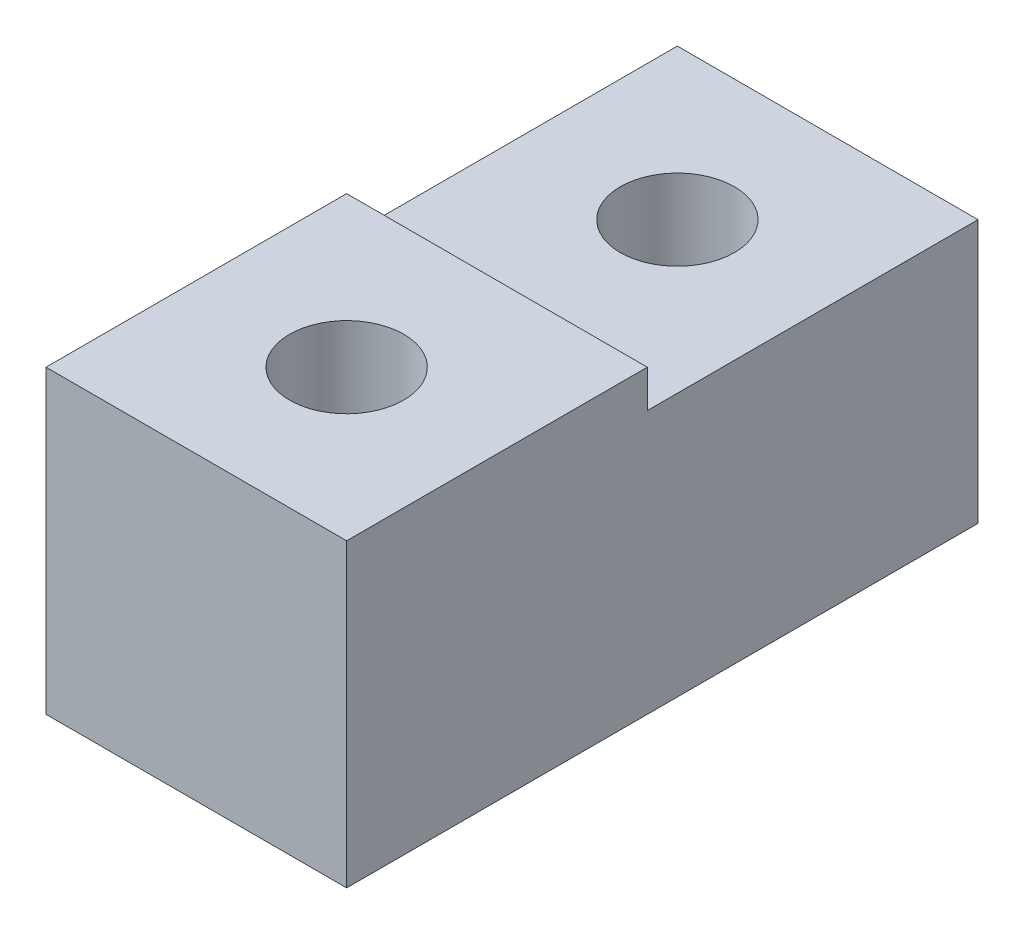
ISO-10303-21;
HEADER;
FILE_DESCRIPTION(('STEP AP214'),'2;1');
FILE_NAME('part.step','',(''),(''),'','','');
FILE_SCHEMA(('AUTOMOTIVE_DESIGN { 1 0 10303 214 1 1 1 1 }'));
ENDSEC;
DATA;
#1=APPLICATION_CONTEXT('core data for automotive mechanical design processes');
#2=APPLICATION_PROTOCOL_DEFINITION('international standard','automotive_design',2000,#1);
#3=PRODUCT_CONTEXT('',#1,'mechanical');
#4=PRODUCT('Part','Part','',(#3));
#5=PRODUCT_RELATED_PRODUCT_CATEGORY('part','',(#4));
#6=PRODUCT_DEFINITION_FORMATION('','',#4);
#7=PRODUCT_DEFINITION_CONTEXT('part definition',#1,'design');
#8=PRODUCT_DEFINITION('design','',#6,#7);
#9=PRODUCT_DEFINITION_SHAPE('','',#8);
#10=(LENGTH_UNIT() NAMED_UNIT(*) SI_UNIT(.MILLI.,.METRE.));
#11=(NAMED_UNIT(*) PLANE_ANGLE_UNIT() SI_UNIT($,.RADIAN.));
#12=(NAMED_UNIT(*) SI_UNIT($,.STERADIAN.) SOLID_ANGLE_UNIT());
#13=UNCERTAINTY_MEASURE_WITH_UNIT(LENGTH_MEASURE(1.E-05),#10,'distance_accuracy_value','');
#14=(GEOMETRIC_REPRESENTATION_CONTEXT(3) GLOBAL_UNCERTAINTY_ASSIGNED_CONTEXT((#13)) GLOBAL_UNIT_ASSIGNED_CONTEXT((#10,
#11,#12)) REPRESENTATION_CONTEXT('',''));
#15=CARTESIAN_POINT('',(0.,0.,0.));
#16=DIRECTION('',(0.,0.,1.));
#17=DIRECTION('',(1.,0.,0.));
#18=AXIS2_PLACEMENT_3D('',#15,#16,#17);
#19=CARTESIAN_POINT('',(-5.,10.,-10.5));
#20=DIRECTION('',(0.,0.,1.));
#21=DIRECTION('',(1.,0.,0.));
#22=AXIS2_PLACEMENT_3D('',#19,#20,#21);
#23=PLANE('',#22);
#24=DIRECTION('',(-1.,0.,0.));
#25=VECTOR('',#24,1.);
#26=CARTESIAN_POINT('',(-5.,8.75,-10.5));
#27=LINE('',#26,#25);
#28=CARTESIAN_POINT('',(5.,8.75,-10.5));
#29=VERTEX_POINT('',#28);
#30=CARTESIAN_POINT('',(-5.,8.75,-10.5));
#31=VERTEX_POINT('',#30);
#32=EDGE_CURVE('E120',#29,#31,#27,.T.);
#33=ORIENTED_EDGE('',*,*,#32,.F.);
#34=DIRECTION('',(0.,-1.,0.));
#35=VECTOR('',#34,1.);
#36=CARTESIAN_POINT('',(5.,10.,-10.5));
#37=LINE('',#36,#35);
#38=CARTESIAN_POINT('',(5.,0.,-10.5));
#39=VERTEX_POINT('',#38);
#40=EDGE_CURVE('E11',#29,#39,#37,.T.);
#41=ORIENTED_EDGE('',*,*,#40,.T.);
#42=DIRECTION('',(-1.,0.,0.));
#43=VECTOR('',#42,1.);
#44=CARTESIAN_POINT('',(-5.,0.,-10.5));
#45=LINE('',#44,#43);
#46=CARTESIAN_POINT('',(-5.,0.,-10.5));
#47=VERTEX_POINT('',#46);
#48=EDGE_CURVE('E99',#39,#47,#45,.T.);
#49=ORIENTED_EDGE('',*,*,#48,.T.);
#50=DIRECTION('',(0.,-1.,0.));
#51=VECTOR('',#50,1.);
#52=CARTESIAN_POINT('',(-5.,10.,-10.5));
#53=LINE('',#52,#51);
#54=EDGE_CURVE('E42',#31,#47,#53,.T.);
#55=ORIENTED_EDGE('',*,*,#54,.F.);
#56=EDGE_LOOP('',(#33,#41,#49,#55));
#57=FACE_BOUND('',#56,.T.);
#58=ADVANCED_FACE('F33',(#57),#23,.F.);
#59=CARTESIAN_POINT('',(5.,10.,10.5));
#60=DIRECTION('',(-1.,0.,0.));
#61=DIRECTION('',(0.,0.,1.));
#62=AXIS2_PLACEMENT_3D('',#59,#60,#61);
#63=PLANE('',#62);
#64=DIRECTION('',(0.,0.,-1.));
#65=VECTOR('',#64,1.);
#66=CARTESIAN_POINT('',(5.,8.75,-10.5));
#67=LINE('',#66,#65);
#68=CARTESIAN_POINT('',(5.,8.75,0.5));
#69=VERTEX_POINT('',#68);
#70=EDGE_CURVE('E123',#69,#29,#67,.T.);
#71=ORIENTED_EDGE('',*,*,#70,.F.);
#72=DIRECTION('',(0.,1.,0.));
#73=VECTOR('',#72,1.);
#74=CARTESIAN_POINT('',(5.,8.75,0.5));
#75=LINE('',#74,#73);
#76=CARTESIAN_POINT('',(5.,10.,0.5));
#77=VERTEX_POINT('',#76);
#78=EDGE_CURVE('E100',#69,#77,#75,.T.);
#79=ORIENTED_EDGE('',*,*,#78,.T.);
#80=DIRECTION('',(0.,0.,-1.));
#81=VECTOR('',#80,1.);
#82=CARTESIAN_POINT('',(5.,10.,10.5));
#83=LINE('',#82,#81);
#84=CARTESIAN_POINT('',(5.,10.,10.5));
#85=VERTEX_POINT('',#84);
#86=EDGE_CURVE('E86',#85,#77,#83,.T.);
#87=ORIENTED_EDGE('',*,*,#86,.F.);
#88=DIRECTION('',(0.,-1.,0.));
#89=VECTOR('',#88,1.);
#90=CARTESIAN_POINT('',(5.,10.,10.5));
#91=LINE('',#90,#89);
#92=CARTESIAN_POINT('',(5.,0.,10.5));
#93=VERTEX_POINT('',#92);
#94=EDGE_CURVE('E79',#85,#93,#91,.T.);
#95=ORIENTED_EDGE('',*,*,#94,.T.);
#96=DIRECTION('',(0.,0.,-1.));
#97=VECTOR('',#96,1.);
#98=CARTESIAN_POINT('',(5.,0.,10.5));
#99=LINE('',#98,#97);
#100=EDGE_CURVE('E93',#93,#39,#99,.T.);
#101=ORIENTED_EDGE('',*,*,#100,.T.);
#102=ORIENTED_EDGE('',*,*,#40,.F.);
#103=EDGE_LOOP('',(#71,#79,#87,#95,#101,#102));
#104=FACE_BOUND('',#103,.T.);
#105=ADVANCED_FACE('F35',(#104),#63,.F.);
#106=CARTESIAN_POINT('',(-5.,10.,10.5));
#107=DIRECTION('',(1.,0.,0.));
#108=DIRECTION('',(0.,0.,-1.));
#109=AXIS2_PLACEMENT_3D('',#106,#107,#108);
#110=PLANE('',#109);
#111=DIRECTION('',(0.,0.,1.));
#112=VECTOR('',#111,1.);
#113=CARTESIAN_POINT('',(-5.,10.,10.5));
#114=LINE('',#113,#112);
#115=CARTESIAN_POINT('',(-5.,10.,0.500000000000004));
#116=VERTEX_POINT('',#115);
#117=CARTESIAN_POINT('',(-5.,10.,10.5));
#118=VERTEX_POINT('',#117);
#119=EDGE_CURVE('E139',#116,#118,#114,.T.);
#120=ORIENTED_EDGE('',*,*,#119,.F.);
#121=DIRECTION('',(0.,1.,0.));
#122=VECTOR('',#121,1.);
#123=CARTESIAN_POINT('',(-5.,8.75,0.5));
#124=LINE('',#123,#122);
#125=CARTESIAN_POINT('',(-5.,8.75,0.5));
#126=VERTEX_POINT('',#125);
#127=EDGE_CURVE('E49',#126,#116,#124,.T.);
#128=ORIENTED_EDGE('',*,*,#127,.F.);
#129=DIRECTION('',(0.,0.,1.));
#130=VECTOR('',#129,1.);
#131=CARTESIAN_POINT('',(-5.,8.75,-10.5));
#132=LINE('',#131,#130);
#133=EDGE_CURVE('E115',#31,#126,#132,.T.);
#134=ORIENTED_EDGE('',*,*,#133,.F.);
#135=ORIENTED_EDGE('',*,*,#54,.T.);
#136=DIRECTION('',(0.,0.,1.));
#137=VECTOR('',#136,1.);
#138=CARTESIAN_POINT('',(-5.,0.,10.5));
#139=LINE('',#138,#137);
#140=CARTESIAN_POINT('',(-5.,0.,10.5));
#141=VERTEX_POINT('',#140);
#142=EDGE_CURVE('E87',#47,#141,#139,.T.);
#143=ORIENTED_EDGE('',*,*,#142,.T.);
#144=DIRECTION('',(0.,-1.,0.));
#145=VECTOR('',#144,1.);
#146=CARTESIAN_POINT('',(-5.,10.,10.5));
#147=LINE('',#146,#145);
#148=EDGE_CURVE('E82',#118,#141,#147,.T.);
#149=ORIENTED_EDGE('',*,*,#148,.F.);
#150=EDGE_LOOP('',(#120,#128,#134,#135,#143,#149));
#151=FACE_BOUND('',#150,.T.);
#152=ADVANCED_FACE('F113',(#151),#110,.F.);
#153=CARTESIAN_POINT('',(-5.,10.,10.5));
#154=DIRECTION('',(0.,0.,-1.));
#155=DIRECTION('',(-1.,0.,0.));
#156=AXIS2_PLACEMENT_3D('',#153,#154,#155);
#157=PLANE('',#156);
#158=DIRECTION('',(1.,0.,0.));
#159=VECTOR('',#158,1.);
#160=CARTESIAN_POINT('',(-5.,0.,10.5));
#161=LINE('',#160,#159);
#162=EDGE_CURVE('E76',#141,#93,#161,.T.);
#163=ORIENTED_EDGE('',*,*,#162,.T.);
#164=ORIENTED_EDGE('',*,*,#94,.F.);
#165=DIRECTION('',(1.,0.,0.));
#166=VECTOR('',#165,1.);
#167=CARTESIAN_POINT('',(-5.,10.,10.5));
#168=LINE('',#167,#166);
#169=EDGE_CURVE('E58',#118,#85,#168,.T.);
#170=ORIENTED_EDGE('',*,*,#169,.F.);
#171=ORIENTED_EDGE('',*,*,#148,.T.);
#172=EDGE_LOOP('',(#163,#164,#170,#171));
#173=FACE_BOUND('',#172,.T.);
#174=ADVANCED_FACE('F78',(#173),#157,.F.);
#175=CARTESIAN_POINT('',(0.,10.,0.));
#176=DIRECTION('',(0.,-1.,0.));
#177=DIRECTION('',(0.,0.,-1.));
#178=AXIS2_PLACEMENT_3D('',#175,#176,#177);
#179=PLANE('',#178);
#180=CARTESIAN_POINT('',(0.,10.,5.5));
#181=DIRECTION('',(0.,-1.,0.));
#182=DIRECTION('',(0.,0.,-1.));
#183=AXIS2_PLACEMENT_3D('',#180,#181,#182);
#184=CIRCLE('',#183,1.89865);
#185=CARTESIAN_POINT('',(0.,10.,3.60135));
#186=VERTEX_POINT('',#185);
#187=EDGE_CURVE('E145',#186,#186,#184,.T.);
#188=ORIENTED_EDGE('',*,*,#187,.T.);
#189=EDGE_LOOP('',(#188));
#190=FACE_BOUND('',#189,.T.);
#191=ORIENTED_EDGE('',*,*,#86,.T.);
#192=DIRECTION('',(1.,0.,0.));
#193=VECTOR('',#192,1.);
#194=CARTESIAN_POINT('',(-5.,10.,0.5));
#195=LINE('',#194,#193);
#196=EDGE_CURVE('E133',#116,#77,#195,.T.);
#197=ORIENTED_EDGE('',*,*,#196,.F.);
#198=ORIENTED_EDGE('',*,*,#119,.T.);
#199=ORIENTED_EDGE('',*,*,#169,.T.);
#200=EDGE_LOOP('',(#191,#197,#198,#199));
#201=FACE_BOUND('',#200,.T.);
#202=ADVANCED_FACE('F144',(#190,#201),#179,.F.);
#203=CARTESIAN_POINT('',(0.,0.,0.));
#204=DIRECTION('',(0.,-1.,0.));
#205=DIRECTION('',(0.,0.,-1.));
#206=AXIS2_PLACEMENT_3D('',#203,#204,#205);
#207=PLANE('',#206);
#208=CARTESIAN_POINT('',(0.,0.,-5.5));
#209=DIRECTION('',(0.,-1.,0.));
#210=DIRECTION('',(0.,0.,-1.));
#211=AXIS2_PLACEMENT_3D('',#208,#209,#210);
#212=CIRCLE('',#211,3.5433);
#213=CARTESIAN_POINT('',(0.,0.,-9.0433));
#214=VERTEX_POINT('',#213);
#215=EDGE_CURVE('E162',#214,#214,#212,.T.);
#216=ORIENTED_EDGE('',*,*,#215,.F.);
#217=EDGE_LOOP('',(#216));
#218=FACE_BOUND('',#217,.T.);
#219=CARTESIAN_POINT('',(0.,0.,5.5));
#220=DIRECTION('',(0.,-1.,0.));
#221=DIRECTION('',(0.,0.,-1.));
#222=AXIS2_PLACEMENT_3D('',#219,#220,#221);
#223=CIRCLE('',#222,3.96875);
#224=CARTESIAN_POINT('',(0.,0.,1.53125000000001));
#225=VERTEX_POINT('',#224);
#226=EDGE_CURVE('E156',#225,#225,#223,.T.);
#227=ORIENTED_EDGE('',*,*,#226,.F.);
#228=EDGE_LOOP('',(#227));
#229=FACE_BOUND('',#228,.T.);
#230=ORIENTED_EDGE('',*,*,#100,.F.);
#231=ORIENTED_EDGE('',*,*,#162,.F.);
#232=ORIENTED_EDGE('',*,*,#142,.F.);
#233=ORIENTED_EDGE('',*,*,#48,.F.);
#234=EDGE_LOOP('',(#230,#231,#232,#233));
#235=FACE_BOUND('',#234,.T.);
#236=ADVANCED_FACE('F97',(#218,#229,#235),#207,.T.);
#237=CARTESIAN_POINT('',(-5.,8.75,0.5));
#238=DIRECTION('',(0.,0.,1.));
#239=DIRECTION('',(1.,0.,0.));
#240=AXIS2_PLACEMENT_3D('',#237,#238,#239);
#241=PLANE('',#240);
#242=ORIENTED_EDGE('',*,*,#196,.T.);
#243=ORIENTED_EDGE('',*,*,#78,.F.);
#244=DIRECTION('',(1.,0.,0.));
#245=VECTOR('',#244,1.);
#246=CARTESIAN_POINT('',(-5.,8.75,0.5));
#247=LINE('',#246,#245);
#248=EDGE_CURVE('E134',#126,#69,#247,.T.);
#249=ORIENTED_EDGE('',*,*,#248,.F.);
#250=ORIENTED_EDGE('',*,*,#127,.T.);
#251=EDGE_LOOP('',(#242,#243,#249,#250));
#252=FACE_BOUND('',#251,.T.);
#253=ADVANCED_FACE('F135',(#252),#241,.F.);
#254=CARTESIAN_POINT('',(0.,8.75,0.));
#255=DIRECTION('',(0.,1.,0.));
#256=DIRECTION('',(0.,0.,1.));
#257=AXIS2_PLACEMENT_3D('',#254,#255,#256);
#258=PLANE('',#257);
#259=CARTESIAN_POINT('',(0.,8.75,-5.5));
#260=DIRECTION('',(0.,1.,0.));
#261=DIRECTION('',(0.,0.,1.));
#262=AXIS2_PLACEMENT_3D('',#259,#260,#261);
#263=CIRCLE('',#262,1.89865);
#264=CARTESIAN_POINT('',(0.,8.75,-3.60135));
#265=VERTEX_POINT('',#264);
#266=EDGE_CURVE('E37',#265,#265,#263,.T.);
#267=ORIENTED_EDGE('',*,*,#266,.F.);
#268=EDGE_LOOP('',(#267));
#269=FACE_BOUND('',#268,.T.);
#270=ORIENTED_EDGE('',*,*,#133,.T.);
#271=ORIENTED_EDGE('',*,*,#248,.T.);
#272=ORIENTED_EDGE('',*,*,#70,.T.);
#273=ORIENTED_EDGE('',*,*,#32,.T.);
#274=EDGE_LOOP('',(#270,#271,#272,#273));
#275=FACE_BOUND('',#274,.T.);
#276=ADVANCED_FACE('F137',(#269,#275),#258,.T.);
#277=CARTESIAN_POINT('',(0.,0.,5.5));
#278=DIRECTION('',(0.,-1.,0.));
#279=DIRECTION('',(0.,0.,-1.));
#280=AXIS2_PLACEMENT_3D('',#277,#278,#279);
#281=CYLINDRICAL_SURFACE('',#280,1.89865);
#282=ORIENTED_EDGE('',*,*,#187,.F.);
#283=EDGE_LOOP('',(#282));
#284=FACE_BOUND('',#283,.T.);
#285=CARTESIAN_POINT('',(0.,2.2098,5.5));
#286=DIRECTION('',(0.,-1.,0.));
#287=DIRECTION('',(0.,0.,-1.));
#288=AXIS2_PLACEMENT_3D('',#285,#286,#287);
#289=CIRCLE('',#288,1.89865000000001);
#290=CARTESIAN_POINT('',(0.,2.2098,3.60134999999999));
#291=VERTEX_POINT('',#290);
#292=EDGE_CURVE('E147',#291,#291,#289,.T.);
#293=ORIENTED_EDGE('',*,*,#292,.T.);
#294=EDGE_LOOP('',(#293));
#295=FACE_BOUND('',#294,.T.);
#296=ADVANCED_FACE('F185',(#284,#295),#281,.F.);
#297=CARTESIAN_POINT('',(1.89865000000001,2.2098,5.5));
#298=DIRECTION('',(0.,1.,0.));
#299=DIRECTION('',(0.,0.,1.));
#300=AXIS2_PLACEMENT_3D('',#297,#298,#299);
#301=PLANE('',#300);
#302=ORIENTED_EDGE('',*,*,#292,.F.);
#303=EDGE_LOOP('',(#302));
#304=FACE_BOUND('',#303,.T.);
#305=CARTESIAN_POINT('',(0.,2.2098,5.5));
#306=DIRECTION('',(0.,-1.,0.));
#307=DIRECTION('',(0.,0.,-1.));
#308=AXIS2_PLACEMENT_3D('',#305,#306,#307);
#309=CIRCLE('',#308,3.96875);
#310=CARTESIAN_POINT('',(0.,2.2098,1.53125000000001));
#311=VERTEX_POINT('',#310);
#312=EDGE_CURVE('E153',#311,#311,#309,.T.);
#313=ORIENTED_EDGE('',*,*,#312,.T.);
#314=EDGE_LOOP('',(#313));
#315=FACE_BOUND('',#314,.T.);
#316=ADVANCED_FACE('F176',(#304,#315),#301,.F.);
#317=CARTESIAN_POINT('',(0.,0.,5.5));
#318=DIRECTION('',(0.,-1.,0.));
#319=DIRECTION('',(0.,0.,-1.));
#320=AXIS2_PLACEMENT_3D('',#317,#318,#319);
#321=CYLINDRICAL_SURFACE('',#320,3.96875);
#322=ORIENTED_EDGE('',*,*,#312,.F.);
#323=EDGE_LOOP('',(#322));
#324=FACE_BOUND('',#323,.T.);
#325=ORIENTED_EDGE('',*,*,#226,.T.);
#326=EDGE_LOOP('',(#325));
#327=FACE_BOUND('',#326,.T.);
#328=ADVANCED_FACE('F173',(#324,#327),#321,.F.);
#329=CARTESIAN_POINT('',(0.,0.,-5.5));
#330=DIRECTION('',(0.,-1.,0.));
#331=DIRECTION('',(0.,0.,-1.));
#332=AXIS2_PLACEMENT_3D('',#329,#330,#331);
#333=CYLINDRICAL_SURFACE('',#332,1.89865);
#334=ORIENTED_EDGE('',*,*,#266,.T.);
#335=EDGE_LOOP('',(#334));
#336=FACE_BOUND('',#335,.T.);
#337=CARTESIAN_POINT('',(0.,1.38002520841572,-5.5));
#338=DIRECTION('',(0.,-1.,0.));
#339=DIRECTION('',(0.,0.,-1.));
#340=AXIS2_PLACEMENT_3D('',#337,#338,#339);
#341=CIRCLE('',#340,1.89865);
#342=CARTESIAN_POINT('',(0.,1.38002520841572,-7.39865));
#343=VERTEX_POINT('',#342);
#344=EDGE_CURVE('E159',#343,#343,#341,.T.);
#345=ORIENTED_EDGE('',*,*,#344,.T.);
#346=EDGE_LOOP('',(#345));
#347=FACE_BOUND('',#346,.T.);
#348=ADVANCED_FACE('F175',(#336,#347),#333,.F.);
#349=CARTESIAN_POINT('',(0.,0.,-5.5));
#350=DIRECTION('',(0.,-1.,0.));
#351=DIRECTION('',(0.,0.,-1.));
#352=AXIS2_PLACEMENT_3D('',#349,#350,#351);
#353=CONICAL_SURFACE('',#352,3.5433,0.872664625997163);
#354=ORIENTED_EDGE('',*,*,#344,.F.);
#355=EDGE_LOOP('',(#354));
#356=FACE_BOUND('',#355,.T.);
#357=ORIENTED_EDGE('',*,*,#215,.T.);
#358=EDGE_LOOP('',(#357));
#359=FACE_BOUND('',#358,.T.);
#360=ADVANCED_FACE('F166',(#356,#359),#353,.F.);
#361=CLOSED_SHELL('',(#58,#105,#152,#174,#202,#236,#253,#276,#296,#316,#328,#348,#360));
#362=MANIFOLD_SOLID_BREP('B2',#361);
#363=ADVANCED_BREP_SHAPE_REPRESENTATION('',(#18,#362),#14);
#364=SHAPE_DEFINITION_REPRESENTATION(#9,#363);
ENDSEC;
END-ISO-10303-21;
